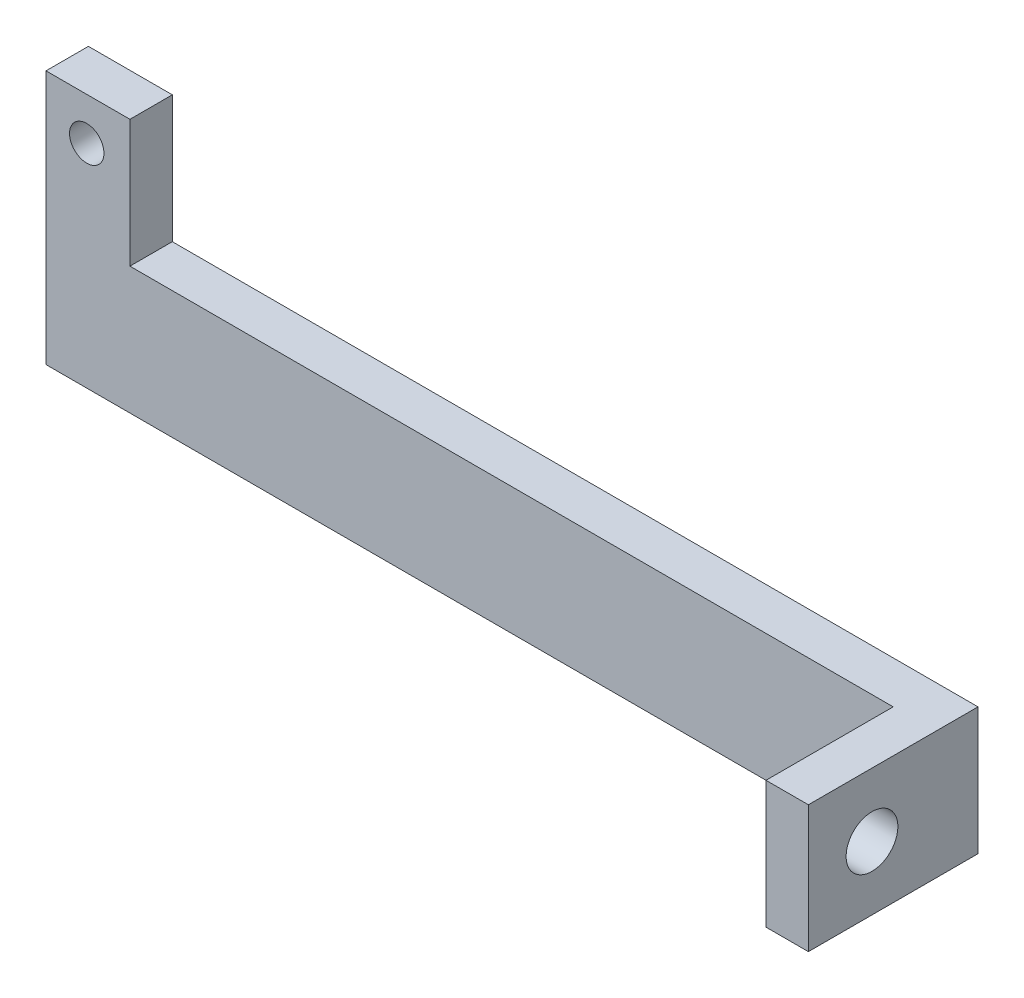
ISO-10303-21;
HEADER;
FILE_DESCRIPTION(('STEP AP214'),'2;1');
FILE_NAME('part.step','',(''),(''),'','','');
FILE_SCHEMA(('AUTOMOTIVE_DESIGN { 1 0 10303 214 1 1 1 1 }'));
ENDSEC;
DATA;
#1=APPLICATION_CONTEXT('core data for automotive mechanical design processes');
#2=APPLICATION_PROTOCOL_DEFINITION('international standard','automotive_design',2000,#1);
#3=PRODUCT_CONTEXT('',#1,'mechanical');
#4=PRODUCT('Part','Part','',(#3));
#5=PRODUCT_RELATED_PRODUCT_CATEGORY('part','',(#4));
#6=PRODUCT_DEFINITION_FORMATION('','',#4);
#7=PRODUCT_DEFINITION_CONTEXT('part definition',#1,'design');
#8=PRODUCT_DEFINITION('design','',#6,#7);
#9=PRODUCT_DEFINITION_SHAPE('','',#8);
#10=(LENGTH_UNIT() NAMED_UNIT(*) SI_UNIT(.MILLI.,.METRE.));
#11=(NAMED_UNIT(*) PLANE_ANGLE_UNIT() SI_UNIT($,.RADIAN.));
#12=(NAMED_UNIT(*) SI_UNIT($,.STERADIAN.) SOLID_ANGLE_UNIT());
#13=UNCERTAINTY_MEASURE_WITH_UNIT(LENGTH_MEASURE(1.E-05),#10,'distance_accuracy_value','');
#14=(GEOMETRIC_REPRESENTATION_CONTEXT(3) GLOBAL_UNCERTAINTY_ASSIGNED_CONTEXT((#13)) GLOBAL_UNIT_ASSIGNED_CONTEXT((#10,
#11,#12)) REPRESENTATION_CONTEXT('',''));
#15=CARTESIAN_POINT('',(0.,0.,0.));
#16=DIRECTION('',(0.,0.,1.));
#17=DIRECTION('',(1.,0.,0.));
#18=AXIS2_PLACEMENT_3D('',#15,#16,#17);
#19=CARTESIAN_POINT('',(0.,0.,2.54));
#20=DIRECTION('',(0.,0.,-1.));
#21=DIRECTION('',(-1.,0.,0.));
#22=AXIS2_PLACEMENT_3D('',#19,#20,#21);
#23=PLANE('',#22);
#24=CARTESIAN_POINT('',(-2.58628231701846,12.7,2.54));
#25=DIRECTION('',(0.,0.,1.));
#26=DIRECTION('',(1.,0.,0.));
#27=AXIS2_PLACEMENT_3D('',#24,#25,#26);
#28=CIRCLE('',#27,1.03050741601968);
#29=CARTESIAN_POINT('',(-1.55577490099879,12.7,2.54));
#30=VERTEX_POINT('',#29);
#31=EDGE_CURVE('E148',#30,#30,#28,.T.);
#32=ORIENTED_EDGE('',*,*,#31,.F.);
#33=EDGE_LOOP('',(#32));
#34=FACE_BOUND('',#33,.T.);
#35=DIRECTION('',(0.,-1.,0.));
#36=VECTOR('',#35,1.);
#37=CARTESIAN_POINT('',(45.72,7.62,2.54));
#38=LINE('',#37,#36);
#39=CARTESIAN_POINT('',(45.72,7.62,2.54));
#40=VERTEX_POINT('',#39);
#41=CARTESIAN_POINT('',(45.72,0.,2.54));
#42=VERTEX_POINT('',#41);
#43=EDGE_CURVE('E54',#40,#42,#38,.T.);
#44=ORIENTED_EDGE('',*,*,#43,.F.);
#45=DIRECTION('',(-1.,0.,0.));
#46=VECTOR('',#45,1.);
#47=CARTESIAN_POINT('',(0.,7.62,2.54));
#48=LINE('',#47,#46);
#49=CARTESIAN_POINT('',(0.,7.62,2.54));
#50=VERTEX_POINT('',#49);
#51=EDGE_CURVE('E59',#40,#50,#48,.T.);
#52=ORIENTED_EDGE('',*,*,#51,.T.);
#53=DIRECTION('',(0.,1.,0.));
#54=VECTOR('',#53,1.);
#55=CARTESIAN_POINT('',(0.,0.,2.54));
#56=LINE('',#55,#54);
#57=CARTESIAN_POINT('',(0.,15.24,2.54));
#58=VERTEX_POINT('',#57);
#59=EDGE_CURVE('E103',#50,#58,#56,.T.);
#60=ORIENTED_EDGE('',*,*,#59,.T.);
#61=DIRECTION('',(-1.,0.,0.));
#62=VECTOR('',#61,1.);
#63=CARTESIAN_POINT('',(0.,15.24,2.54));
#64=LINE('',#63,#62);
#65=CARTESIAN_POINT('',(-5.02695771843362,15.24,2.54));
#66=VERTEX_POINT('',#65);
#67=EDGE_CURVE('E156',#58,#66,#64,.T.);
#68=ORIENTED_EDGE('',*,*,#67,.T.);
#69=DIRECTION('',(0.,-1.,0.));
#70=VECTOR('',#69,1.);
#71=CARTESIAN_POINT('',(-5.02695771843362,0.,2.54));
#72=LINE('',#71,#70);
#73=CARTESIAN_POINT('',(-5.02695771843362,0.,2.54));
#74=VERTEX_POINT('',#73);
#75=EDGE_CURVE('E118',#66,#74,#72,.T.);
#76=ORIENTED_EDGE('',*,*,#75,.T.);
#77=DIRECTION('',(1.,0.,0.));
#78=VECTOR('',#77,1.);
#79=CARTESIAN_POINT('',(0.,0.,2.54));
#80=LINE('',#79,#78);
#81=EDGE_CURVE('E84',#74,#42,#80,.T.);
#82=ORIENTED_EDGE('',*,*,#81,.T.);
#83=EDGE_LOOP('',(#44,#52,#60,#68,#76,#82));
#84=FACE_BOUND('',#83,.T.);
#85=ADVANCED_FACE('F39',(#34,#84),#23,.F.);
#86=CARTESIAN_POINT('',(0.,0.,2.54));
#87=DIRECTION('',(0.,1.,0.));
#88=DIRECTION('',(0.,0.,1.));
#89=AXIS2_PLACEMENT_3D('',#86,#87,#88);
#90=PLANE('',#89);
#91=DIRECTION('',(1.,0.,0.));
#92=VECTOR('',#91,1.);
#93=CARTESIAN_POINT('',(0.,0.,0.));
#94=LINE('',#93,#92);
#95=CARTESIAN_POINT('',(-5.02695771843362,0.,0.));
#96=VERTEX_POINT('',#95);
#97=CARTESIAN_POINT('',(48.26,0.,0.));
#98=VERTEX_POINT('',#97);
#99=EDGE_CURVE('E72',#96,#98,#94,.T.);
#100=ORIENTED_EDGE('',*,*,#99,.T.);
#101=DIRECTION('',(0.,0.,-1.));
#102=VECTOR('',#101,1.);
#103=CARTESIAN_POINT('',(48.26,0.,2.54));
#104=LINE('',#103,#102);
#105=CARTESIAN_POINT('',(48.26,0.,10.16));
#106=VERTEX_POINT('',#105);
#107=EDGE_CURVE('E11',#106,#98,#104,.T.);
#108=ORIENTED_EDGE('',*,*,#107,.F.);
#109=DIRECTION('',(1.,0.,0.));
#110=VECTOR('',#109,1.);
#111=CARTESIAN_POINT('',(45.72,0.,10.16));
#112=LINE('',#111,#110);
#113=CARTESIAN_POINT('',(45.72,0.,10.16));
#114=VERTEX_POINT('',#113);
#115=EDGE_CURVE('E124',#114,#106,#112,.T.);
#116=ORIENTED_EDGE('',*,*,#115,.F.);
#117=DIRECTION('',(0.,0.,1.));
#118=VECTOR('',#117,1.);
#119=CARTESIAN_POINT('',(45.72,0.,2.54));
#120=LINE('',#119,#118);
#121=EDGE_CURVE('E122',#42,#114,#120,.T.);
#122=ORIENTED_EDGE('',*,*,#121,.F.);
#123=ORIENTED_EDGE('',*,*,#81,.F.);
#124=DIRECTION('',(0.,0.,-1.));
#125=VECTOR('',#124,1.);
#126=CARTESIAN_POINT('',(-5.02695771843362,0.,2.54));
#127=LINE('',#126,#125);
#128=EDGE_CURVE('E160',#74,#96,#127,.T.);
#129=ORIENTED_EDGE('',*,*,#128,.T.);
#130=EDGE_LOOP('',(#100,#108,#116,#122,#123,#129));
#131=FACE_BOUND('',#130,.T.);
#132=ADVANCED_FACE('F41',(#131),#90,.F.);
#133=CARTESIAN_POINT('',(48.26,0.,2.54));
#134=DIRECTION('',(-1.,0.,0.));
#135=DIRECTION('',(0.,0.,1.));
#136=AXIS2_PLACEMENT_3D('',#133,#134,#135);
#137=PLANE('',#136);
#138=CARTESIAN_POINT('',(48.26,3.81,6.35));
#139=DIRECTION('',(-1.,0.,0.));
#140=DIRECTION('',(0.,0.,1.));
#141=AXIS2_PLACEMENT_3D('',#138,#139,#140);
#142=CIRCLE('',#141,1.55);
#143=CARTESIAN_POINT('',(48.26,3.81,7.9));
#144=VERTEX_POINT('',#143);
#145=EDGE_CURVE('E136',#144,#144,#142,.T.);
#146=ORIENTED_EDGE('',*,*,#145,.T.);
#147=EDGE_LOOP('',(#146));
#148=FACE_BOUND('',#147,.T.);
#149=DIRECTION('',(0.,1.,0.));
#150=VECTOR('',#149,1.);
#151=CARTESIAN_POINT('',(48.26,0.,0.));
#152=LINE('',#151,#150);
#153=CARTESIAN_POINT('',(48.26,7.62,0.));
#154=VERTEX_POINT('',#153);
#155=EDGE_CURVE('E175',#98,#154,#152,.T.);
#156=ORIENTED_EDGE('',*,*,#155,.T.);
#157=DIRECTION('',(0.,0.,-1.));
#158=VECTOR('',#157,1.);
#159=CARTESIAN_POINT('',(48.26,7.62,2.54));
#160=LINE('',#159,#158);
#161=CARTESIAN_POINT('',(48.26,7.62,10.16));
#162=VERTEX_POINT('',#161);
#163=EDGE_CURVE('E47',#162,#154,#160,.T.);
#164=ORIENTED_EDGE('',*,*,#163,.F.);
#165=DIRECTION('',(0.,1.,0.));
#166=VECTOR('',#165,1.);
#167=CARTESIAN_POINT('',(48.26,7.62,10.16));
#168=LINE('',#167,#166);
#169=EDGE_CURVE('E133',#106,#162,#168,.T.);
#170=ORIENTED_EDGE('',*,*,#169,.F.);
#171=ORIENTED_EDGE('',*,*,#107,.T.);
#172=EDGE_LOOP('',(#156,#164,#170,#171));
#173=FACE_BOUND('',#172,.T.);
#174=ADVANCED_FACE('F211',(#148,#173),#137,.F.);
#175=CARTESIAN_POINT('',(0.,7.62,2.54));
#176=DIRECTION('',(0.,-1.,0.));
#177=DIRECTION('',(0.,0.,-1.));
#178=AXIS2_PLACEMENT_3D('',#175,#176,#177);
#179=PLANE('',#178);
#180=DIRECTION('',(-1.,0.,0.));
#181=VECTOR('',#180,1.);
#182=CARTESIAN_POINT('',(0.,7.62,0.));
#183=LINE('',#182,#181);
#184=CARTESIAN_POINT('',(0.,7.62,0.));
#185=VERTEX_POINT('',#184);
#186=EDGE_CURVE('E78',#154,#185,#183,.T.);
#187=ORIENTED_EDGE('',*,*,#186,.T.);
#188=DIRECTION('',(0.,0.,-1.));
#189=VECTOR('',#188,1.);
#190=CARTESIAN_POINT('',(0.,7.62,2.54));
#191=LINE('',#190,#189);
#192=EDGE_CURVE('E173',#50,#185,#191,.T.);
#193=ORIENTED_EDGE('',*,*,#192,.F.);
#194=ORIENTED_EDGE('',*,*,#51,.F.);
#195=DIRECTION('',(0.,0.,-1.));
#196=VECTOR('',#195,1.);
#197=CARTESIAN_POINT('',(45.72,7.62,2.54));
#198=LINE('',#197,#196);
#199=CARTESIAN_POINT('',(45.72,7.62,10.16));
#200=VERTEX_POINT('',#199);
#201=EDGE_CURVE('E132',#200,#40,#198,.T.);
#202=ORIENTED_EDGE('',*,*,#201,.F.);
#203=DIRECTION('',(1.,0.,0.));
#204=VECTOR('',#203,1.);
#205=CARTESIAN_POINT('',(45.72,7.62,10.16));
#206=LINE('',#205,#204);
#207=EDGE_CURVE('E143',#200,#162,#206,.T.);
#208=ORIENTED_EDGE('',*,*,#207,.T.);
#209=ORIENTED_EDGE('',*,*,#163,.T.);
#210=EDGE_LOOP('',(#187,#193,#194,#202,#208,#209));
#211=FACE_BOUND('',#210,.T.);
#212=ADVANCED_FACE('F178',(#211),#179,.F.);
#213=CARTESIAN_POINT('',(0.,0.,0.));
#214=DIRECTION('',(0.,0.,-1.));
#215=DIRECTION('',(-1.,0.,0.));
#216=AXIS2_PLACEMENT_3D('',#213,#214,#215);
#217=PLANE('',#216);
#218=CARTESIAN_POINT('',(-2.58628231701846,12.7,0.));
#219=DIRECTION('',(0.,0.,1.));
#220=DIRECTION('',(1.,0.,0.));
#221=AXIS2_PLACEMENT_3D('',#218,#219,#220);
#222=CIRCLE('',#221,1.03050741601968);
#223=CARTESIAN_POINT('',(-1.55577490099879,12.7,0.));
#224=VERTEX_POINT('',#223);
#225=EDGE_CURVE('E149',#224,#224,#222,.T.);
#226=ORIENTED_EDGE('',*,*,#225,.T.);
#227=EDGE_LOOP('',(#226));
#228=FACE_BOUND('',#227,.T.);
#229=ORIENTED_EDGE('',*,*,#99,.F.);
#230=DIRECTION('',(0.,-1.,0.));
#231=VECTOR('',#230,1.);
#232=CARTESIAN_POINT('',(-5.02695771843362,0.,0.));
#233=LINE('',#232,#231);
#234=CARTESIAN_POINT('',(-5.02695771843362,15.24,0.));
#235=VERTEX_POINT('',#234);
#236=EDGE_CURVE('E157',#235,#96,#233,.T.);
#237=ORIENTED_EDGE('',*,*,#236,.F.);
#238=DIRECTION('',(-1.,0.,0.));
#239=VECTOR('',#238,1.);
#240=CARTESIAN_POINT('',(0.,15.24,0.));
#241=LINE('',#240,#239);
#242=CARTESIAN_POINT('',(0.,15.24,0.));
#243=VERTEX_POINT('',#242);
#244=EDGE_CURVE('E162',#243,#235,#241,.T.);
#245=ORIENTED_EDGE('',*,*,#244,.F.);
#246=DIRECTION('',(0.,1.,0.));
#247=VECTOR('',#246,1.);
#248=CARTESIAN_POINT('',(0.,0.,0.));
#249=LINE('',#248,#247);
#250=EDGE_CURVE('E152',#185,#243,#249,.T.);
#251=ORIENTED_EDGE('',*,*,#250,.F.);
#252=ORIENTED_EDGE('',*,*,#186,.F.);
#253=ORIENTED_EDGE('',*,*,#155,.F.);
#254=EDGE_LOOP('',(#229,#237,#245,#251,#252,#253));
#255=FACE_BOUND('',#254,.T.);
#256=ADVANCED_FACE('F183',(#228,#255),#217,.T.);
#257=CARTESIAN_POINT('',(0.,0.,2.54));
#258=DIRECTION('',(-1.,0.,0.));
#259=DIRECTION('',(0.,0.,1.));
#260=AXIS2_PLACEMENT_3D('',#257,#258,#259);
#261=PLANE('',#260);
#262=ORIENTED_EDGE('',*,*,#59,.F.);
#263=ORIENTED_EDGE('',*,*,#192,.T.);
#264=ORIENTED_EDGE('',*,*,#250,.T.);
#265=DIRECTION('',(0.,0.,-1.));
#266=VECTOR('',#265,1.);
#267=CARTESIAN_POINT('',(0.,15.24,2.54));
#268=LINE('',#267,#266);
#269=EDGE_CURVE('E169',#58,#243,#268,.T.);
#270=ORIENTED_EDGE('',*,*,#269,.F.);
#271=EDGE_LOOP('',(#262,#263,#264,#270));
#272=FACE_BOUND('',#271,.T.);
#273=ADVANCED_FACE('F187',(#272),#261,.F.);
#274=CARTESIAN_POINT('',(0.,15.24,2.54));
#275=DIRECTION('',(0.,-1.,0.));
#276=DIRECTION('',(1.,0.,0.));
#277=AXIS2_PLACEMENT_3D('',#274,#275,#276);
#278=PLANE('',#277);
#279=ORIENTED_EDGE('',*,*,#244,.T.);
#280=DIRECTION('',(0.,0.,-1.));
#281=VECTOR('',#280,1.);
#282=CARTESIAN_POINT('',(-5.02695771843362,15.24,2.54));
#283=LINE('',#282,#281);
#284=EDGE_CURVE('E166',#66,#235,#283,.T.);
#285=ORIENTED_EDGE('',*,*,#284,.F.);
#286=ORIENTED_EDGE('',*,*,#67,.F.);
#287=ORIENTED_EDGE('',*,*,#269,.T.);
#288=EDGE_LOOP('',(#279,#285,#286,#287));
#289=FACE_BOUND('',#288,.T.);
#290=ADVANCED_FACE('F189',(#289),#278,.F.);
#291=CARTESIAN_POINT('',(-5.02695771843362,0.,2.54));
#292=DIRECTION('',(1.,0.,0.));
#293=DIRECTION('',(0.,0.,-1.));
#294=AXIS2_PLACEMENT_3D('',#291,#292,#293);
#295=PLANE('',#294);
#296=ORIENTED_EDGE('',*,*,#236,.T.);
#297=ORIENTED_EDGE('',*,*,#128,.F.);
#298=ORIENTED_EDGE('',*,*,#75,.F.);
#299=ORIENTED_EDGE('',*,*,#284,.T.);
#300=EDGE_LOOP('',(#296,#297,#298,#299));
#301=FACE_BOUND('',#300,.T.);
#302=ADVANCED_FACE('F192',(#301),#295,.F.);
#303=CARTESIAN_POINT('',(-2.58628231701846,12.7,0.));
#304=DIRECTION('',(0.,0.,1.));
#305=DIRECTION('',(1.,0.,0.));
#306=AXIS2_PLACEMENT_3D('',#303,#304,#305);
#307=CYLINDRICAL_SURFACE('',#306,1.03050741601968);
#308=ORIENTED_EDGE('',*,*,#225,.F.);
#309=EDGE_LOOP('',(#308));
#310=FACE_BOUND('',#309,.T.);
#311=ORIENTED_EDGE('',*,*,#31,.T.);
#312=EDGE_LOOP('',(#311));
#313=FACE_BOUND('',#312,.T.);
#314=ADVANCED_FACE('F194',(#310,#313),#307,.F.);
#315=CARTESIAN_POINT('',(45.72,7.62,10.16));
#316=DIRECTION('',(0.,0.,-1.));
#317=DIRECTION('',(0.,1.,0.));
#318=AXIS2_PLACEMENT_3D('',#315,#316,#317);
#319=PLANE('',#318);
#320=ORIENTED_EDGE('',*,*,#169,.T.);
#321=ORIENTED_EDGE('',*,*,#207,.F.);
#322=DIRECTION('',(0.,1.,0.));
#323=VECTOR('',#322,1.);
#324=CARTESIAN_POINT('',(45.72,7.62,10.16));
#325=LINE('',#324,#323);
#326=EDGE_CURVE('E127',#114,#200,#325,.T.);
#327=ORIENTED_EDGE('',*,*,#326,.F.);
#328=ORIENTED_EDGE('',*,*,#115,.T.);
#329=EDGE_LOOP('',(#320,#321,#327,#328));
#330=FACE_BOUND('',#329,.T.);
#331=ADVANCED_FACE('F201',(#330),#319,.F.);
#332=CARTESIAN_POINT('',(45.72,0.,0.));
#333=DIRECTION('',(-1.,0.,0.));
#334=DIRECTION('',(0.,0.,1.));
#335=AXIS2_PLACEMENT_3D('',#332,#333,#334);
#336=PLANE('',#335);
#337=CARTESIAN_POINT('',(45.72,3.81,6.35));
#338=DIRECTION('',(-1.,0.,0.));
#339=DIRECTION('',(0.,0.,1.));
#340=AXIS2_PLACEMENT_3D('',#337,#338,#339);
#341=CIRCLE('',#340,1.55);
#342=CARTESIAN_POINT('',(45.72,3.81,7.9));
#343=VERTEX_POINT('',#342);
#344=EDGE_CURVE('E139',#343,#343,#341,.T.);
#345=ORIENTED_EDGE('',*,*,#344,.F.);
#346=EDGE_LOOP('',(#345));
#347=FACE_BOUND('',#346,.T.);
#348=ORIENTED_EDGE('',*,*,#43,.T.);
#349=ORIENTED_EDGE('',*,*,#121,.T.);
#350=ORIENTED_EDGE('',*,*,#326,.T.);
#351=ORIENTED_EDGE('',*,*,#201,.T.);
#352=EDGE_LOOP('',(#348,#349,#350,#351));
#353=FACE_BOUND('',#352,.T.);
#354=ADVANCED_FACE('F130',(#347,#353),#336,.T.);
#355=CARTESIAN_POINT('',(48.26,3.81,6.35));
#356=DIRECTION('',(-1.,0.,0.));
#357=DIRECTION('',(0.,0.,1.));
#358=AXIS2_PLACEMENT_3D('',#355,#356,#357);
#359=CYLINDRICAL_SURFACE('',#358,1.55);
#360=ORIENTED_EDGE('',*,*,#145,.F.);
#361=EDGE_LOOP('',(#360));
#362=FACE_BOUND('',#361,.T.);
#363=ORIENTED_EDGE('',*,*,#344,.T.);
#364=EDGE_LOOP('',(#363));
#365=FACE_BOUND('',#364,.T.);
#366=ADVANCED_FACE('F230',(#362,#365),#359,.F.);
#367=CLOSED_SHELL('',(#85,#132,#174,#212,#256,#273,#290,#302,#314,#331,#354,#366));
#368=MANIFOLD_SOLID_BREP('B2',#367);
#369=ADVANCED_BREP_SHAPE_REPRESENTATION('',(#18,#368),#14);
#370=SHAPE_DEFINITION_REPRESENTATION(#9,#369);
ENDSEC;
END-ISO-10303-21;
